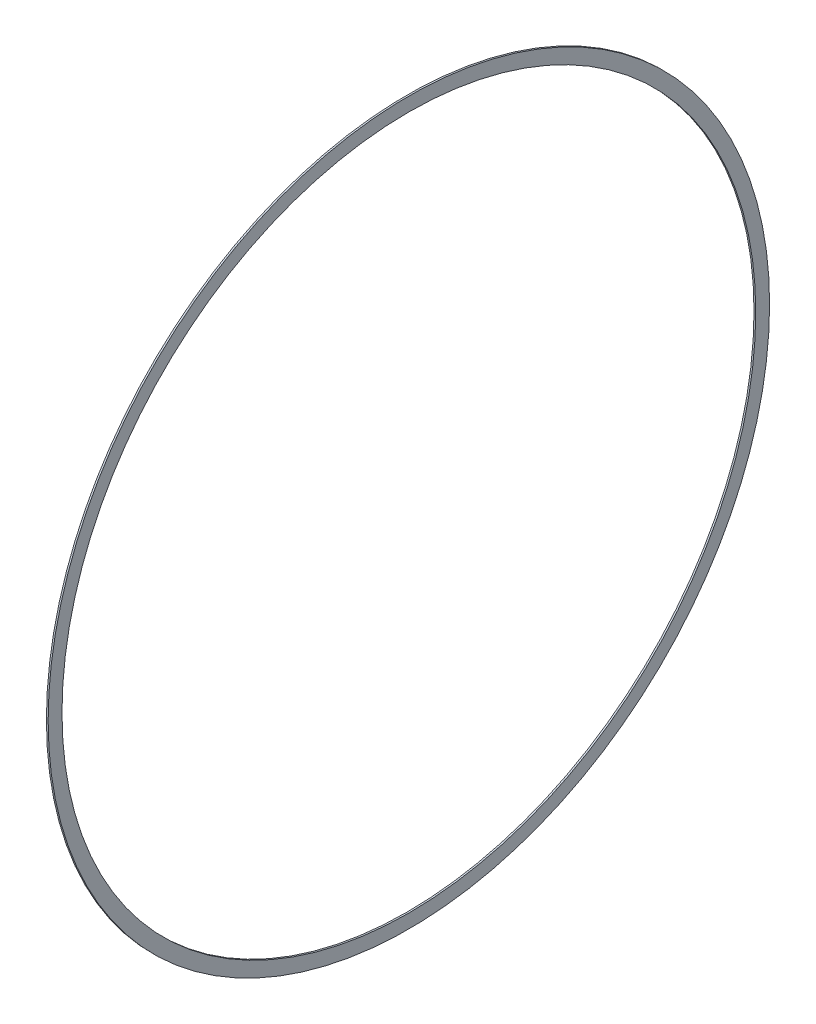
ISO-10303-21;
HEADER;
FILE_DESCRIPTION(('STEP AP214'),'2;1');
FILE_NAME('part.step','',(''),(''),'','','');
FILE_SCHEMA(('AUTOMOTIVE_DESIGN { 1 0 10303 214 1 1 1 1 }'));
ENDSEC;
DATA;
#1=APPLICATION_CONTEXT('core data for automotive mechanical design processes');
#2=APPLICATION_PROTOCOL_DEFINITION('international standard','automotive_design',2000,#1);
#3=PRODUCT_CONTEXT('',#1,'mechanical');
#4=PRODUCT('Part','Part','',(#3));
#5=PRODUCT_RELATED_PRODUCT_CATEGORY('part','',(#4));
#6=PRODUCT_DEFINITION_FORMATION('','',#4);
#7=PRODUCT_DEFINITION_CONTEXT('part definition',#1,'design');
#8=PRODUCT_DEFINITION('design','',#6,#7);
#9=PRODUCT_DEFINITION_SHAPE('','',#8);
#10=(LENGTH_UNIT() NAMED_UNIT(*) SI_UNIT(.MILLI.,.METRE.));
#11=(NAMED_UNIT(*) PLANE_ANGLE_UNIT() SI_UNIT($,.RADIAN.));
#12=(NAMED_UNIT(*) SI_UNIT($,.STERADIAN.) SOLID_ANGLE_UNIT());
#13=UNCERTAINTY_MEASURE_WITH_UNIT(LENGTH_MEASURE(1.E-05),#10,'distance_accuracy_value','');
#14=(GEOMETRIC_REPRESENTATION_CONTEXT(3) GLOBAL_UNCERTAINTY_ASSIGNED_CONTEXT((#13)) GLOBAL_UNIT_ASSIGNED_CONTEXT((#10,
#11,#12)) REPRESENTATION_CONTEXT('',''));
#15=CARTESIAN_POINT('',(0.,0.,0.));
#16=DIRECTION('',(0.,0.,1.));
#17=DIRECTION('',(1.,0.,0.));
#18=AXIS2_PLACEMENT_3D('',#15,#16,#17);
#19=CARTESIAN_POINT('',(5.,0.,0.));
#20=DIRECTION('',(1.,0.,0.));
#21=DIRECTION('',(0.,0.,-1.));
#22=AXIS2_PLACEMENT_3D('',#19,#20,#21);
#23=PLANE('',#22);
#24=CARTESIAN_POINT('',(5.,0.,0.));
#25=DIRECTION('',(1.,0.,0.));
#26=DIRECTION('',(0.,0.,-1.));
#27=AXIS2_PLACEMENT_3D('',#24,#25,#26);
#28=CIRCLE('',#27,1042.);
#29=CARTESIAN_POINT('',(5.,0.,-1042.));
#30=VERTEX_POINT('',#29);
#31=EDGE_CURVE('E12',#30,#30,#28,.T.);
#32=ORIENTED_EDGE('',*,*,#31,.T.);
#33=EDGE_LOOP('',(#32));
#34=FACE_BOUND('',#33,.T.);
#35=CARTESIAN_POINT('',(5.,0.,0.));
#36=DIRECTION('',(1.,0.,0.));
#37=DIRECTION('',(0.,0.,-1.));
#38=AXIS2_PLACEMENT_3D('',#35,#36,#37);
#39=CIRCLE('',#38,1002.);
#40=CARTESIAN_POINT('',(5.,0.,-1002.));
#41=VERTEX_POINT('',#40);
#42=EDGE_CURVE('E51',#41,#41,#39,.T.);
#43=ORIENTED_EDGE('',*,*,#42,.F.);
#44=EDGE_LOOP('',(#43));
#45=FACE_BOUND('',#44,.T.);
#46=ADVANCED_FACE('F40',(#34,#45),#23,.T.);
#47=CARTESIAN_POINT('',(0.,0.,0.));
#48=DIRECTION('',(1.,0.,0.));
#49=DIRECTION('',(0.,0.,-1.));
#50=AXIS2_PLACEMENT_3D('',#47,#48,#49);
#51=PLANE('',#50);
#52=CARTESIAN_POINT('',(0.,0.,0.));
#53=DIRECTION('',(1.,0.,0.));
#54=DIRECTION('',(0.,0.,-1.));
#55=AXIS2_PLACEMENT_3D('',#52,#53,#54);
#56=CIRCLE('',#55,1042.);
#57=CARTESIAN_POINT('',(0.,0.,-1042.));
#58=VERTEX_POINT('',#57);
#59=EDGE_CURVE('E44',#58,#58,#56,.T.);
#60=ORIENTED_EDGE('',*,*,#59,.F.);
#61=EDGE_LOOP('',(#60));
#62=FACE_BOUND('',#61,.T.);
#63=CARTESIAN_POINT('',(0.,0.,0.));
#64=DIRECTION('',(1.,0.,0.));
#65=DIRECTION('',(0.,0.,-1.));
#66=AXIS2_PLACEMENT_3D('',#63,#64,#65);
#67=CIRCLE('',#66,1002.);
#68=CARTESIAN_POINT('',(0.,0.,-1002.));
#69=VERTEX_POINT('',#68);
#70=EDGE_CURVE('E53',#69,#69,#67,.T.);
#71=ORIENTED_EDGE('',*,*,#70,.T.);
#72=EDGE_LOOP('',(#71));
#73=FACE_BOUND('',#72,.T.);
#74=ADVANCED_FACE('F63',(#62,#73),#51,.F.);
#75=CARTESIAN_POINT('',(5.,0.,0.));
#76=DIRECTION('',(-1.,0.,0.));
#77=DIRECTION('',(0.,0.,1.));
#78=AXIS2_PLACEMENT_3D('',#75,#76,#77);
#79=CYLINDRICAL_SURFACE('',#78,1042.);
#80=ORIENTED_EDGE('',*,*,#31,.F.);
#81=EDGE_LOOP('',(#80));
#82=FACE_BOUND('',#81,.T.);
#83=ORIENTED_EDGE('',*,*,#59,.T.);
#84=EDGE_LOOP('',(#83));
#85=FACE_BOUND('',#84,.T.);
#86=ADVANCED_FACE('F42',(#82,#85),#79,.T.);
#87=CARTESIAN_POINT('',(5.,0.,0.));
#88=DIRECTION('',(-1.,0.,0.));
#89=DIRECTION('',(0.,0.,1.));
#90=AXIS2_PLACEMENT_3D('',#87,#88,#89);
#91=CYLINDRICAL_SURFACE('',#90,1002.);
#92=ORIENTED_EDGE('',*,*,#42,.T.);
#93=EDGE_LOOP('',(#92));
#94=FACE_BOUND('',#93,.T.);
#95=ORIENTED_EDGE('',*,*,#70,.F.);
#96=EDGE_LOOP('',(#95));
#97=FACE_BOUND('',#96,.T.);
#98=ADVANCED_FACE('F59',(#94,#97),#91,.F.);
#99=CLOSED_SHELL('',(#46,#74,#86,#98));
#100=MANIFOLD_SOLID_BREP('B2',#99);
#101=ADVANCED_BREP_SHAPE_REPRESENTATION('',(#18,#100),#14);
#102=SHAPE_DEFINITION_REPRESENTATION(#9,#101);
ENDSEC;
END-ISO-10303-21;
